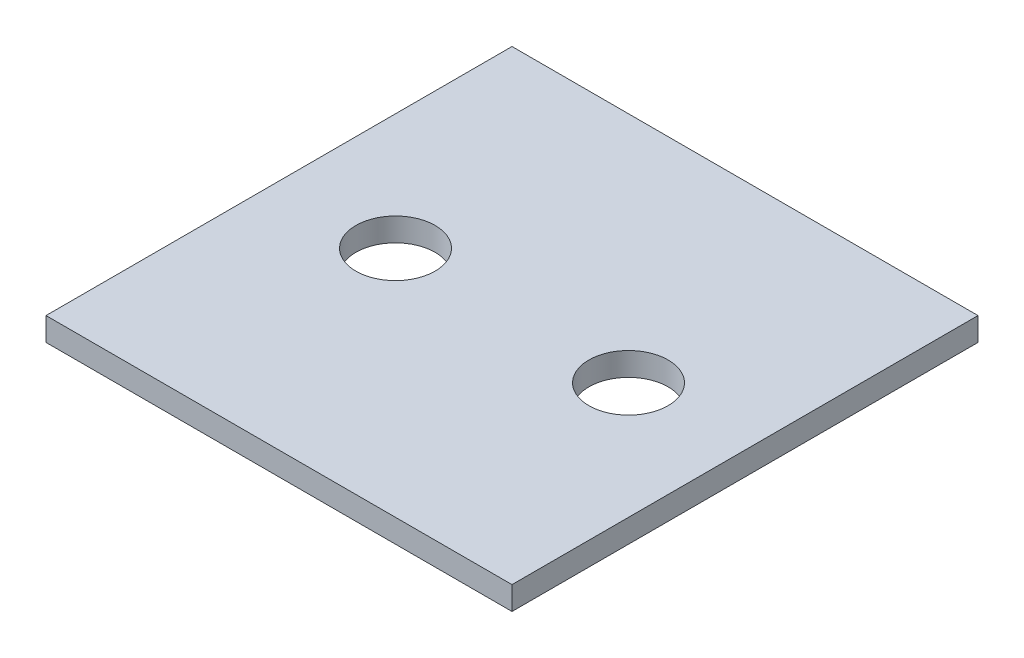
ISO-10303-21;
HEADER;
FILE_DESCRIPTION(('STEP AP214'),'2;1');
FILE_NAME('part.step','',(''),(''),'','','');
FILE_SCHEMA(('AUTOMOTIVE_DESIGN { 1 0 10303 214 1 1 1 1 }'));
ENDSEC;
DATA;
#1=APPLICATION_CONTEXT('core data for automotive mechanical design processes');
#2=APPLICATION_PROTOCOL_DEFINITION('international standard','automotive_design',2000,#1);
#3=PRODUCT_CONTEXT('',#1,'mechanical');
#4=PRODUCT('Part','Part','',(#3));
#5=PRODUCT_RELATED_PRODUCT_CATEGORY('part','',(#4));
#6=PRODUCT_DEFINITION_FORMATION('','',#4);
#7=PRODUCT_DEFINITION_CONTEXT('part definition',#1,'design');
#8=PRODUCT_DEFINITION('design','',#6,#7);
#9=PRODUCT_DEFINITION_SHAPE('','',#8);
#10=(LENGTH_UNIT() NAMED_UNIT(*) SI_UNIT(.MILLI.,.METRE.));
#11=(NAMED_UNIT(*) PLANE_ANGLE_UNIT() SI_UNIT($,.RADIAN.));
#12=(NAMED_UNIT(*) SI_UNIT($,.STERADIAN.) SOLID_ANGLE_UNIT());
#13=UNCERTAINTY_MEASURE_WITH_UNIT(LENGTH_MEASURE(1.E-05),#10,'distance_accuracy_value','');
#14=(GEOMETRIC_REPRESENTATION_CONTEXT(3) GLOBAL_UNCERTAINTY_ASSIGNED_CONTEXT((#13)) GLOBAL_UNIT_ASSIGNED_CONTEXT((#10,
#11,#12)) REPRESENTATION_CONTEXT('',''));
#15=CARTESIAN_POINT('',(0.,0.,0.));
#16=DIRECTION('',(0.,0.,1.));
#17=DIRECTION('',(1.,0.,0.));
#18=AXIS2_PLACEMENT_3D('',#15,#16,#17);
#19=CARTESIAN_POINT('',(0.,1.0012,0.));
#20=DIRECTION('',(0.,-1.,0.));
#21=DIRECTION('',(0.,0.,-1.));
#22=AXIS2_PLACEMENT_3D('',#19,#20,#21);
#23=PLANE('',#22);
#24=CARTESIAN_POINT('',(15.,1.0012,10.));
#25=DIRECTION('',(0.,-1.,0.));
#26=DIRECTION('',(0.,0.,-1.));
#27=AXIS2_PLACEMENT_3D('',#24,#25,#26);
#28=CIRCLE('',#27,1.7);
#29=CARTESIAN_POINT('',(15.,1.0012,8.3));
#30=VERTEX_POINT('',#29);
#31=EDGE_CURVE('E83',#30,#30,#28,.T.);
#32=ORIENTED_EDGE('',*,*,#31,.T.);
#33=EDGE_LOOP('',(#32));
#34=FACE_BOUND('',#33,.T.);
#35=CARTESIAN_POINT('',(5.,1.0012,10.));
#36=DIRECTION('',(0.,-1.,0.));
#37=DIRECTION('',(0.,0.,-1.));
#38=AXIS2_PLACEMENT_3D('',#35,#36,#37);
#39=CIRCLE('',#38,1.7);
#40=CARTESIAN_POINT('',(5.,1.0012,8.3));
#41=VERTEX_POINT('',#40);
#42=EDGE_CURVE('E19',#41,#41,#39,.T.);
#43=ORIENTED_EDGE('',*,*,#42,.T.);
#44=EDGE_LOOP('',(#43));
#45=FACE_BOUND('',#44,.T.);
#46=DIRECTION('',(0.,0.,-1.));
#47=VECTOR('',#46,1.);
#48=CARTESIAN_POINT('',(20.,1.0012,0.));
#49=LINE('',#48,#47);
#50=CARTESIAN_POINT('',(20.,1.0012,0.));
#51=VERTEX_POINT('',#50);
#52=CARTESIAN_POINT('',(20.,1.0012,20.));
#53=VERTEX_POINT('',#52);
#54=EDGE_CURVE('E61',#51,#53,#49,.F.);
#55=ORIENTED_EDGE('',*,*,#54,.F.);
#56=DIRECTION('',(1.,0.,0.));
#57=VECTOR('',#56,1.);
#58=CARTESIAN_POINT('',(0.,1.0012,0.));
#59=LINE('',#58,#57);
#60=CARTESIAN_POINT('',(0.,1.0012,0.));
#61=VERTEX_POINT('',#60);
#62=EDGE_CURVE('E55',#51,#61,#59,.F.);
#63=ORIENTED_EDGE('',*,*,#62,.T.);
#64=DIRECTION('',(0.,0.,-1.));
#65=VECTOR('',#64,1.);
#66=CARTESIAN_POINT('',(0.,1.0012,0.));
#67=LINE('',#66,#65);
#68=CARTESIAN_POINT('',(0.,1.0012,20.));
#69=VERTEX_POINT('',#68);
#70=EDGE_CURVE('E59',#61,#69,#67,.F.);
#71=ORIENTED_EDGE('',*,*,#70,.T.);
#72=DIRECTION('',(1.,0.,0.));
#73=VECTOR('',#72,1.);
#74=CARTESIAN_POINT('',(0.,1.0012,20.));
#75=LINE('',#74,#73);
#76=EDGE_CURVE('E94',#53,#69,#75,.F.);
#77=ORIENTED_EDGE('',*,*,#76,.F.);
#78=EDGE_LOOP('',(#55,#63,#71,#77));
#79=FACE_BOUND('',#78,.T.);
#80=ADVANCED_FACE('F16',(#34,#45,#79),#23,.F.);
#81=CARTESIAN_POINT('',(0.,1.0012,0.));
#82=DIRECTION('',(1.,0.,0.));
#83=DIRECTION('',(0.,0.,-1.));
#84=AXIS2_PLACEMENT_3D('',#81,#82,#83);
#85=PLANE('',#84);
#86=DIRECTION('',(0.,1.,0.));
#87=VECTOR('',#86,1.);
#88=CARTESIAN_POINT('',(0.,1.0012,20.));
#89=LINE('',#88,#87);
#90=CARTESIAN_POINT('',(0.,0.00119999999996867,20.));
#91=VERTEX_POINT('',#90);
#92=EDGE_CURVE('E69',#69,#91,#89,.F.);
#93=ORIENTED_EDGE('',*,*,#92,.F.);
#94=ORIENTED_EDGE('',*,*,#70,.F.);
#95=DIRECTION('',(0.,1.,0.));
#96=VECTOR('',#95,1.);
#97=CARTESIAN_POINT('',(0.,1.0012,0.));
#98=LINE('',#97,#96);
#99=CARTESIAN_POINT('',(0.,0.00119999999996867,0.));
#100=VERTEX_POINT('',#99);
#101=EDGE_CURVE('E63',#61,#100,#98,.F.);
#102=ORIENTED_EDGE('',*,*,#101,.T.);
#103=DIRECTION('',(0.,0.,-1.));
#104=VECTOR('',#103,1.);
#105=CARTESIAN_POINT('',(0.,0.001199999999926,0.));
#106=LINE('',#105,#104);
#107=EDGE_CURVE('E85',#91,#100,#106,.T.);
#108=ORIENTED_EDGE('',*,*,#107,.F.);
#109=EDGE_LOOP('',(#93,#94,#102,#108));
#110=FACE_BOUND('',#109,.T.);
#111=ADVANCED_FACE('F66',(#110),#85,.F.);
#112=CARTESIAN_POINT('',(0.,1.0012,0.));
#113=DIRECTION('',(0.,0.,1.));
#114=DIRECTION('',(1.,0.,0.));
#115=AXIS2_PLACEMENT_3D('',#112,#113,#114);
#116=PLANE('',#115);
#117=DIRECTION('',(1.,0.,0.));
#118=VECTOR('',#117,1.);
#119=CARTESIAN_POINT('',(0.,0.001199999999926,0.));
#120=LINE('',#119,#118);
#121=CARTESIAN_POINT('',(20.,0.00119999999996867,0.));
#122=VERTEX_POINT('',#121);
#123=EDGE_CURVE('E74',#100,#122,#120,.T.);
#124=ORIENTED_EDGE('',*,*,#123,.F.);
#125=ORIENTED_EDGE('',*,*,#101,.F.);
#126=ORIENTED_EDGE('',*,*,#62,.F.);
#127=DIRECTION('',(0.,1.,0.));
#128=VECTOR('',#127,1.);
#129=CARTESIAN_POINT('',(20.,1.0012,0.));
#130=LINE('',#129,#128);
#131=EDGE_CURVE('E76',#122,#51,#130,.T.);
#132=ORIENTED_EDGE('',*,*,#131,.F.);
#133=EDGE_LOOP('',(#124,#125,#126,#132));
#134=FACE_BOUND('',#133,.T.);
#135=ADVANCED_FACE('F72',(#134),#116,.F.);
#136=CARTESIAN_POINT('',(20.,1.0012,0.));
#137=DIRECTION('',(1.,0.,0.));
#138=DIRECTION('',(0.,0.,-1.));
#139=AXIS2_PLACEMENT_3D('',#136,#137,#138);
#140=PLANE('',#139);
#141=DIRECTION('',(0.,1.,0.));
#142=VECTOR('',#141,1.);
#143=CARTESIAN_POINT('',(20.,1.0012,20.));
#144=LINE('',#143,#142);
#145=CARTESIAN_POINT('',(20.,0.00119999999996867,20.));
#146=VERTEX_POINT('',#145);
#147=EDGE_CURVE('E34',#146,#53,#144,.T.);
#148=ORIENTED_EDGE('',*,*,#147,.F.);
#149=DIRECTION('',(0.,0.,-1.));
#150=VECTOR('',#149,1.);
#151=CARTESIAN_POINT('',(20.,0.001199999999926,0.));
#152=LINE('',#151,#150);
#153=EDGE_CURVE('E100',#122,#146,#152,.F.);
#154=ORIENTED_EDGE('',*,*,#153,.F.);
#155=ORIENTED_EDGE('',*,*,#131,.T.);
#156=ORIENTED_EDGE('',*,*,#54,.T.);
#157=EDGE_LOOP('',(#148,#154,#155,#156));
#158=FACE_BOUND('',#157,.T.);
#159=ADVANCED_FACE('F98',(#158),#140,.T.);
#160=CARTESIAN_POINT('',(0.,1.0012,20.));
#161=DIRECTION('',(0.,0.,1.));
#162=DIRECTION('',(1.,0.,0.));
#163=AXIS2_PLACEMENT_3D('',#160,#161,#162);
#164=PLANE('',#163);
#165=DIRECTION('',(1.,0.,0.));
#166=VECTOR('',#165,1.);
#167=CARTESIAN_POINT('',(0.,0.001199999999926,20.));
#168=LINE('',#167,#166);
#169=EDGE_CURVE('E82',#146,#91,#168,.F.);
#170=ORIENTED_EDGE('',*,*,#169,.F.);
#171=ORIENTED_EDGE('',*,*,#147,.T.);
#172=ORIENTED_EDGE('',*,*,#76,.T.);
#173=ORIENTED_EDGE('',*,*,#92,.T.);
#174=EDGE_LOOP('',(#170,#171,#172,#173));
#175=FACE_BOUND('',#174,.T.);
#176=ADVANCED_FACE('F106',(#175),#164,.T.);
#177=CARTESIAN_POINT('',(5.,1.0012,10.));
#178=DIRECTION('',(0.,-1.,0.));
#179=DIRECTION('',(0.,0.,-1.));
#180=AXIS2_PLACEMENT_3D('',#177,#178,#179);
#181=CYLINDRICAL_SURFACE('',#180,1.7);
#182=ORIENTED_EDGE('',*,*,#42,.F.);
#183=EDGE_LOOP('',(#182));
#184=FACE_BOUND('',#183,.T.);
#185=CARTESIAN_POINT('',(5.,0.0011999999999829,10.));
#186=DIRECTION('',(0.,-1.,0.));
#187=DIRECTION('',(0.,0.,-1.));
#188=AXIS2_PLACEMENT_3D('',#185,#186,#187);
#189=CIRCLE('',#188,1.7);
#190=CARTESIAN_POINT('',(5.,0.0011999999999829,8.3));
#191=VERTEX_POINT('',#190);
#192=EDGE_CURVE('E25',#191,#191,#189,.F.);
#193=ORIENTED_EDGE('',*,*,#192,.F.);
#194=EDGE_LOOP('',(#193));
#195=FACE_BOUND('',#194,.T.);
#196=ADVANCED_FACE('F108',(#184,#195),#181,.F.);
#197=CARTESIAN_POINT('',(15.,1.0012,10.));
#198=DIRECTION('',(0.,-1.,0.));
#199=DIRECTION('',(0.,0.,-1.));
#200=AXIS2_PLACEMENT_3D('',#197,#198,#199);
#201=CYLINDRICAL_SURFACE('',#200,1.7);
#202=ORIENTED_EDGE('',*,*,#31,.F.);
#203=EDGE_LOOP('',(#202));
#204=FACE_BOUND('',#203,.T.);
#205=CARTESIAN_POINT('',(15.,0.0011999999999829,10.));
#206=DIRECTION('',(0.,-1.,0.));
#207=DIRECTION('',(0.,0.,-1.));
#208=AXIS2_PLACEMENT_3D('',#205,#206,#207);
#209=CIRCLE('',#208,1.7);
#210=CARTESIAN_POINT('',(15.,0.0011999999999829,8.3));
#211=VERTEX_POINT('',#210);
#212=EDGE_CURVE('E11',#211,#211,#209,.F.);
#213=ORIENTED_EDGE('',*,*,#212,.F.);
#214=EDGE_LOOP('',(#213));
#215=FACE_BOUND('',#214,.T.);
#216=ADVANCED_FACE('F115',(#204,#215),#201,.F.);
#217=CARTESIAN_POINT('',(0.,0.001199999999926,0.));
#218=DIRECTION('',(0.,-1.,0.));
#219=DIRECTION('',(0.,0.,-1.));
#220=AXIS2_PLACEMENT_3D('',#217,#218,#219);
#221=PLANE('',#220);
#222=ORIENTED_EDGE('',*,*,#212,.T.);
#223=EDGE_LOOP('',(#222));
#224=FACE_BOUND('',#223,.T.);
#225=ORIENTED_EDGE('',*,*,#192,.T.);
#226=EDGE_LOOP('',(#225));
#227=FACE_BOUND('',#226,.T.);
#228=ORIENTED_EDGE('',*,*,#153,.T.);
#229=ORIENTED_EDGE('',*,*,#169,.T.);
#230=ORIENTED_EDGE('',*,*,#107,.T.);
#231=ORIENTED_EDGE('',*,*,#123,.T.);
#232=EDGE_LOOP('',(#228,#229,#230,#231));
#233=FACE_BOUND('',#232,.T.);
#234=ADVANCED_FACE('F104',(#224,#227,#233),#221,.T.);
#235=CLOSED_SHELL('',(#80,#111,#135,#159,#176,#196,#216,#234));
#236=MANIFOLD_SOLID_BREP('B1',#235);
#237=ADVANCED_BREP_SHAPE_REPRESENTATION('',(#18,#236),#14);
#238=SHAPE_DEFINITION_REPRESENTATION(#9,#237);
ENDSEC;
END-ISO-10303-21;
